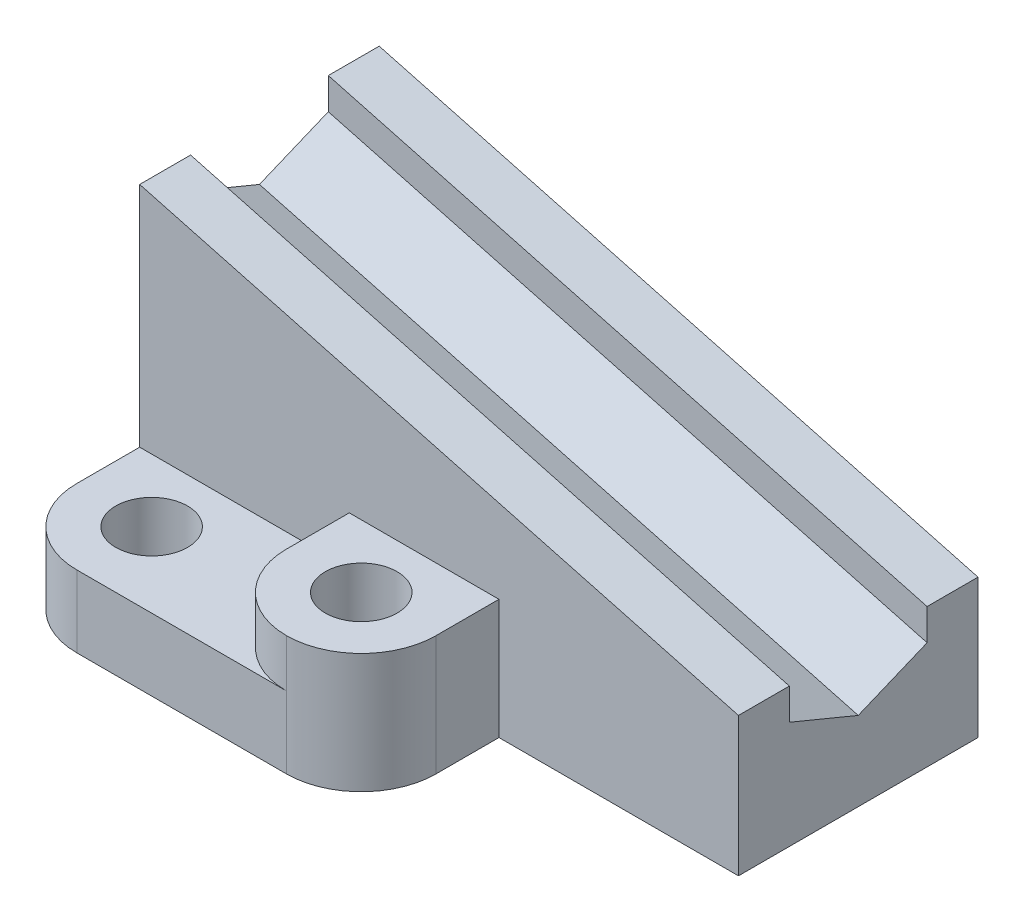
ISO-10303-21;
HEADER;
FILE_DESCRIPTION(('STEP AP214'),'2;1');
FILE_NAME('part.step','',(''),(''),'','','');
FILE_SCHEMA(('AUTOMOTIVE_DESIGN { 1 0 10303 214 1 1 1 1 }'));
ENDSEC;
DATA;
#1=APPLICATION_CONTEXT('core data for automotive mechanical design processes');
#2=APPLICATION_PROTOCOL_DEFINITION('international standard','automotive_design',2000,#1);
#3=PRODUCT_CONTEXT('',#1,'mechanical');
#4=PRODUCT('Part','Part','',(#3));
#5=PRODUCT_RELATED_PRODUCT_CATEGORY('part','',(#4));
#6=PRODUCT_DEFINITION_FORMATION('','',#4);
#7=PRODUCT_DEFINITION_CONTEXT('part definition',#1,'design');
#8=PRODUCT_DEFINITION('design','',#6,#7);
#9=PRODUCT_DEFINITION_SHAPE('','',#8);
#10=(LENGTH_UNIT() NAMED_UNIT(*) SI_UNIT(.MILLI.,.METRE.));
#11=(NAMED_UNIT(*) PLANE_ANGLE_UNIT() SI_UNIT($,.RADIAN.));
#12=(NAMED_UNIT(*) SI_UNIT($,.STERADIAN.) SOLID_ANGLE_UNIT());
#13=UNCERTAINTY_MEASURE_WITH_UNIT(LENGTH_MEASURE(1.E-05),#10,'distance_accuracy_value','');
#14=(GEOMETRIC_REPRESENTATION_CONTEXT(3) GLOBAL_UNCERTAINTY_ASSIGNED_CONTEXT((#13)) GLOBAL_UNIT_ASSIGNED_CONTEXT((#10,
#11,#12)) REPRESENTATION_CONTEXT('',''));
#15=CARTESIAN_POINT('',(0.,0.,0.));
#16=DIRECTION('',(0.,0.,1.));
#17=DIRECTION('',(1.,0.,0.));
#18=AXIS2_PLACEMENT_3D('',#15,#16,#17);
#19=CARTESIAN_POINT('',(0.,50.,-40.));
#20=DIRECTION('',(-0.258819045102514,-0.96592582628907,0.));
#21=DIRECTION('',(0.96592582628907,-0.258819045102514,0.));
#22=AXIS2_PLACEMENT_3D('',#19,#20,#21);
#23=PLANE('',#22);
#24=DIRECTION('',(0.,0.,1.));
#25=VECTOR('',#24,1.);
#26=CARTESIAN_POINT('',(100.,23.2050807568884,-40.));
#27=LINE('',#26,#25);
#28=CARTESIAN_POINT('',(100.,23.2050807568884,-8.49999999999999));
#29=VERTEX_POINT('',#28);
#30=CARTESIAN_POINT('',(100.,23.2050807568884,0.));
#31=VERTEX_POINT('',#30);
#32=EDGE_CURVE('E267',#29,#31,#27,.T.);
#33=ORIENTED_EDGE('',*,*,#32,.F.);
#34=DIRECTION('',(-0.96592582628907,0.258819045102514,0.));
#35=VECTOR('',#34,1.);
#36=CARTESIAN_POINT('',(0.,50.,-8.49999999999999));
#37=LINE('',#36,#35);
#38=CARTESIAN_POINT('',(0.,50.,-8.49999999999999));
#39=VERTEX_POINT('',#38);
#40=EDGE_CURVE('E11',#29,#39,#37,.T.);
#41=ORIENTED_EDGE('',*,*,#40,.T.);
#42=DIRECTION('',(0.,0.,-1.));
#43=VECTOR('',#42,1.);
#44=CARTESIAN_POINT('',(0.,50.,0.));
#45=LINE('',#44,#43);
#46=CARTESIAN_POINT('',(0.,50.,0.));
#47=VERTEX_POINT('',#46);
#48=EDGE_CURVE('E183',#47,#39,#45,.T.);
#49=ORIENTED_EDGE('',*,*,#48,.F.);
#50=DIRECTION('',(0.96592582628907,-0.258819045102514,0.));
#51=VECTOR('',#50,1.);
#52=CARTESIAN_POINT('',(0.,50.,0.));
#53=LINE('',#52,#51);
#54=EDGE_CURVE('E274',#47,#31,#53,.T.);
#55=ORIENTED_EDGE('',*,*,#54,.T.);
#56=EDGE_LOOP('',(#33,#41,#49,#55));
#57=FACE_BOUND('',#56,.T.);
#58=ADVANCED_FACE('F39',(#57),#23,.F.);
#59=CARTESIAN_POINT('',(0.,50.,0.));
#60=DIRECTION('',(0.,0.,-1.));
#61=DIRECTION('',(-1.,0.,0.));
#62=AXIS2_PLACEMENT_3D('',#59,#60,#61);
#63=PLANE('',#62);
#64=DIRECTION('',(0.,-1.,0.));
#65=VECTOR('',#64,1.);
#66=CARTESIAN_POINT('',(100.,50.,0.));
#67=LINE('',#66,#65);
#68=CARTESIAN_POINT('',(100.,0.,0.));
#69=VERTEX_POINT('',#68);
#70=EDGE_CURVE('E217',#31,#69,#67,.T.);
#71=ORIENTED_EDGE('',*,*,#70,.F.);
#72=ORIENTED_EDGE('',*,*,#54,.F.);
#73=DIRECTION('',(0.,-1.,0.));
#74=VECTOR('',#73,1.);
#75=CARTESIAN_POINT('',(0.,50.,0.));
#76=LINE('',#75,#74);
#77=CARTESIAN_POINT('',(0.,12.,0.));
#78=VERTEX_POINT('',#77);
#79=EDGE_CURVE('E189',#47,#78,#76,.T.);
#80=ORIENTED_EDGE('',*,*,#79,.T.);
#81=DIRECTION('',(1.,0.,0.));
#82=VECTOR('',#81,1.);
#83=CARTESIAN_POINT('',(0.,12.,0.));
#84=LINE('',#83,#82);
#85=CARTESIAN_POINT('',(35.,12.,0.));
#86=VERTEX_POINT('',#85);
#87=EDGE_CURVE('E296',#78,#86,#84,.T.);
#88=ORIENTED_EDGE('',*,*,#87,.T.);
#89=DIRECTION('',(0.,-1.,0.));
#90=VECTOR('',#89,1.);
#91=CARTESIAN_POINT('',(35.,20.,0.));
#92=LINE('',#91,#90);
#93=CARTESIAN_POINT('',(35.,20.,0.));
#94=VERTEX_POINT('',#93);
#95=EDGE_CURVE('E284',#94,#86,#92,.T.);
#96=ORIENTED_EDGE('',*,*,#95,.F.);
#97=DIRECTION('',(1.,0.,0.));
#98=VECTOR('',#97,1.);
#99=CARTESIAN_POINT('',(0.,20.,0.));
#100=LINE('',#99,#98);
#101=CARTESIAN_POINT('',(60.,20.,0.));
#102=VERTEX_POINT('',#101);
#103=EDGE_CURVE('E278',#94,#102,#100,.T.);
#104=ORIENTED_EDGE('',*,*,#103,.T.);
#105=DIRECTION('',(0.,-1.,0.));
#106=VECTOR('',#105,1.);
#107=CARTESIAN_POINT('',(60.,20.,0.));
#108=LINE('',#107,#106);
#109=CARTESIAN_POINT('',(60.,0.,0.));
#110=VERTEX_POINT('',#109);
#111=EDGE_CURVE('E289',#102,#110,#108,.T.);
#112=ORIENTED_EDGE('',*,*,#111,.T.);
#113=DIRECTION('',(1.,0.,0.));
#114=VECTOR('',#113,1.);
#115=CARTESIAN_POINT('',(0.,0.,0.));
#116=LINE('',#115,#114);
#117=EDGE_CURVE('E196',#110,#69,#116,.T.);
#118=ORIENTED_EDGE('',*,*,#117,.T.);
#119=EDGE_LOOP('',(#71,#72,#80,#88,#96,#104,#112,#118));
#120=FACE_BOUND('',#119,.T.);
#121=ADVANCED_FACE('F323',(#120),#63,.F.);
#122=CARTESIAN_POINT('',(100.,50.,0.));
#123=DIRECTION('',(-1.,0.,0.));
#124=DIRECTION('',(0.,0.,1.));
#125=AXIS2_PLACEMENT_3D('',#122,#123,#124);
#126=PLANE('',#125);
#127=DIRECTION('',(0.,0.382683432365086,0.923879532511288));
#128=VECTOR('',#127,1.);
#129=CARTESIAN_POINT('',(100.,25.6646397353018,10.0800362668732));
#130=LINE('',#129,#128);
#131=CARTESIAN_POINT('',(100.,13.2050807568884,-20.));
#132=VERTEX_POINT('',#131);
#133=CARTESIAN_POINT('',(100.,17.968536724179,-8.49999999999999));
#134=VERTEX_POINT('',#133);
#135=EDGE_CURVE('E350',#132,#134,#130,.T.);
#136=ORIENTED_EDGE('',*,*,#135,.T.);
#137=DIRECTION('',(0.,1.,0.));
#138=VECTOR('',#137,1.);
#139=CARTESIAN_POINT('',(100.,50.,-8.50000000000001));
#140=LINE('',#139,#138);
#141=EDGE_CURVE('E354',#134,#29,#140,.T.);
#142=ORIENTED_EDGE('',*,*,#141,.T.);
#143=ORIENTED_EDGE('',*,*,#32,.T.);
#144=ORIENTED_EDGE('',*,*,#70,.T.);
#145=DIRECTION('',(0.,0.,-1.));
#146=VECTOR('',#145,1.);
#147=CARTESIAN_POINT('',(100.,0.,0.));
#148=LINE('',#147,#146);
#149=CARTESIAN_POINT('',(100.,0.,-40.));
#150=VERTEX_POINT('',#149);
#151=EDGE_CURVE('E200',#69,#150,#148,.T.);
#152=ORIENTED_EDGE('',*,*,#151,.T.);
#153=DIRECTION('',(0.,-1.,0.));
#154=VECTOR('',#153,1.);
#155=CARTESIAN_POINT('',(100.,50.,-40.));
#156=LINE('',#155,#154);
#157=CARTESIAN_POINT('',(100.,23.2050807568884,-40.));
#158=VERTEX_POINT('',#157);
#159=EDGE_CURVE('E214',#158,#150,#156,.T.);
#160=ORIENTED_EDGE('',*,*,#159,.F.);
#161=CARTESIAN_POINT('',(100.,23.2050807568884,-31.5));
#162=VERTEX_POINT('',#161);
#163=EDGE_CURVE('E258',#158,#162,#27,.T.);
#164=ORIENTED_EDGE('',*,*,#163,.T.);
#165=DIRECTION('',(0.,-1.,0.));
#166=VECTOR('',#165,1.);
#167=CARTESIAN_POINT('',(100.,50.,-31.5));
#168=LINE('',#167,#166);
#169=CARTESIAN_POINT('',(100.,17.968536724179,-31.5));
#170=VERTEX_POINT('',#169);
#171=EDGE_CURVE('E55',#162,#170,#168,.T.);
#172=ORIENTED_EDGE('',*,*,#171,.T.);
#173=DIRECTION('',(0.,-0.382683432365086,0.923879532511288));
#174=VECTOR('',#173,1.);
#175=CARTESIAN_POINT('',(100.,11.5225041115709,-15.9379006431422));
#176=LINE('',#175,#174);
#177=EDGE_CURVE('E358',#170,#132,#176,.T.);
#178=ORIENTED_EDGE('',*,*,#177,.T.);
#179=EDGE_LOOP('',(#136,#142,#143,#144,#152,#160,#164,#172,#178));
#180=FACE_BOUND('',#179,.T.);
#181=ADVANCED_FACE('F344',(#180),#126,.F.);
#182=CARTESIAN_POINT('',(0.,50.,-40.));
#183=DIRECTION('',(0.,0.,-1.));
#184=DIRECTION('',(-1.,0.,0.));
#185=AXIS2_PLACEMENT_3D('',#182,#183,#184);
#186=PLANE('',#185);
#187=DIRECTION('',(0.96592582628907,-0.258819045102514,0.));
#188=VECTOR('',#187,1.);
#189=CARTESIAN_POINT('',(0.,50.,-40.));
#190=LINE('',#189,#188);
#191=CARTESIAN_POINT('',(0.,50.,-40.));
#192=VERTEX_POINT('',#191);
#193=EDGE_CURVE('E180',#192,#158,#190,.T.);
#194=ORIENTED_EDGE('',*,*,#193,.T.);
#195=ORIENTED_EDGE('',*,*,#159,.T.);
#196=DIRECTION('',(1.,0.,0.));
#197=VECTOR('',#196,1.);
#198=CARTESIAN_POINT('',(0.,0.,-40.));
#199=LINE('',#198,#197);
#200=CARTESIAN_POINT('',(0.,0.,-40.));
#201=VERTEX_POINT('',#200);
#202=EDGE_CURVE('E190',#201,#150,#199,.T.);
#203=ORIENTED_EDGE('',*,*,#202,.F.);
#204=DIRECTION('',(0.,-1.,0.));
#205=VECTOR('',#204,1.);
#206=CARTESIAN_POINT('',(0.,50.,-40.));
#207=LINE('',#206,#205);
#208=EDGE_CURVE('E211',#192,#201,#207,.T.);
#209=ORIENTED_EDGE('',*,*,#208,.F.);
#210=EDGE_LOOP('',(#194,#195,#203,#209));
#211=FACE_BOUND('',#210,.T.);
#212=ADVANCED_FACE('F370',(#211),#186,.T.);
#213=CARTESIAN_POINT('',(0.,50.,0.));
#214=DIRECTION('',(-1.,0.,0.));
#215=DIRECTION('',(0.,0.,1.));
#216=AXIS2_PLACEMENT_3D('',#213,#214,#215);
#217=PLANE('',#216);
#218=DIRECTION('',(0.,1.,0.));
#219=VECTOR('',#218,1.);
#220=CARTESIAN_POINT('',(0.,50.,-8.49999999999999));
#221=LINE('',#220,#219);
#222=CARTESIAN_POINT('',(0.,44.7634559672905,-8.49999999999999));
#223=VERTEX_POINT('',#222);
#224=EDGE_CURVE('E351',#223,#39,#221,.T.);
#225=ORIENTED_EDGE('',*,*,#224,.F.);
#226=DIRECTION('',(0.,0.382683432365086,0.923879532511288));
#227=VECTOR('',#226,1.);
#228=CARTESIAN_POINT('',(0.,44.7634559672905,-8.49999999999999));
#229=LINE('',#228,#227);
#230=CARTESIAN_POINT('',(0.,40.,-20.));
#231=VERTEX_POINT('',#230);
#232=EDGE_CURVE('E439',#231,#223,#229,.T.);
#233=ORIENTED_EDGE('',*,*,#232,.F.);
#234=DIRECTION('',(0.,-0.382683432365086,0.923879532511288));
#235=VECTOR('',#234,1.);
#236=CARTESIAN_POINT('',(0.,44.7634559672905,-31.5));
#237=LINE('',#236,#235);
#238=CARTESIAN_POINT('',(0.,44.7634559672905,-31.5));
#239=VERTEX_POINT('',#238);
#240=EDGE_CURVE('E174',#239,#231,#237,.T.);
#241=ORIENTED_EDGE('',*,*,#240,.F.);
#242=DIRECTION('',(0.,-1.,0.));
#243=VECTOR('',#242,1.);
#244=CARTESIAN_POINT('',(0.,50.,-31.5));
#245=LINE('',#244,#243);
#246=CARTESIAN_POINT('',(0.,50.,-31.5));
#247=VERTEX_POINT('',#246);
#248=EDGE_CURVE('E159',#247,#239,#245,.T.);
#249=ORIENTED_EDGE('',*,*,#248,.F.);
#250=EDGE_CURVE('E170',#247,#192,#45,.T.);
#251=ORIENTED_EDGE('',*,*,#250,.T.);
#252=ORIENTED_EDGE('',*,*,#208,.T.);
#253=DIRECTION('',(0.,0.,-1.));
#254=VECTOR('',#253,1.);
#255=CARTESIAN_POINT('',(0.,0.,0.));
#256=LINE('',#255,#254);
#257=CARTESIAN_POINT('',(0.,0.,10.5));
#258=VERTEX_POINT('',#257);
#259=EDGE_CURVE('E184',#258,#201,#256,.T.);
#260=ORIENTED_EDGE('',*,*,#259,.F.);
#261=DIRECTION('',(0.,-1.,0.));
#262=VECTOR('',#261,1.);
#263=CARTESIAN_POINT('',(0.,12.,10.5));
#264=LINE('',#263,#262);
#265=CARTESIAN_POINT('',(0.,12.,10.5));
#266=VERTEX_POINT('',#265);
#267=EDGE_CURVE('E234',#258,#266,#264,.F.);
#268=ORIENTED_EDGE('',*,*,#267,.T.);
#269=DIRECTION('',(0.,0.,1.));
#270=VECTOR('',#269,1.);
#271=CARTESIAN_POINT('',(0.,12.,0.));
#272=LINE('',#271,#270);
#273=EDGE_CURVE('E300',#78,#266,#272,.T.);
#274=ORIENTED_EDGE('',*,*,#273,.F.);
#275=ORIENTED_EDGE('',*,*,#79,.F.);
#276=ORIENTED_EDGE('',*,*,#48,.T.);
#277=EDGE_LOOP('',(#225,#233,#241,#249,#251,#252,#260,#268,#274,#275,#276));
#278=FACE_BOUND('',#277,.T.);
#279=ADVANCED_FACE('F168',(#278),#217,.T.);
#280=CARTESIAN_POINT('',(0.,0.,0.));
#281=DIRECTION('',(0.,1.,0.));
#282=DIRECTION('',(0.,0.,1.));
#283=AXIS2_PLACEMENT_3D('',#280,#281,#282);
#284=PLANE('',#283);
#285=CARTESIAN_POINT('',(12.5,0.,10.5));
#286=DIRECTION('',(0.,1.,0.));
#287=DIRECTION('',(0.,0.,1.));
#288=AXIS2_PLACEMENT_3D('',#285,#286,#287);
#289=CIRCLE('',#288,6.);
#290=CARTESIAN_POINT('',(12.5,0.,16.5));
#291=VERTEX_POINT('',#290);
#292=EDGE_CURVE('E425',#291,#291,#289,.T.);
#293=ORIENTED_EDGE('',*,*,#292,.T.);
#294=EDGE_LOOP('',(#293));
#295=FACE_BOUND('',#294,.T.);
#296=CARTESIAN_POINT('',(47.5,0.,10.5));
#297=DIRECTION('',(0.,1.,0.));
#298=DIRECTION('',(0.,0.,1.));
#299=AXIS2_PLACEMENT_3D('',#296,#297,#298);
#300=CIRCLE('',#299,6.);
#301=CARTESIAN_POINT('',(47.5,0.,16.5));
#302=VERTEX_POINT('',#301);
#303=EDGE_CURVE('E176',#302,#302,#300,.T.);
#304=ORIENTED_EDGE('',*,*,#303,.T.);
#305=EDGE_LOOP('',(#304));
#306=FACE_BOUND('',#305,.T.);
#307=DIRECTION('',(1.,0.,0.));
#308=VECTOR('',#307,1.);
#309=CARTESIAN_POINT('',(0.,0.,23.));
#310=LINE('',#309,#308);
#311=CARTESIAN_POINT('',(12.5,0.,23.));
#312=VERTEX_POINT('',#311);
#313=CARTESIAN_POINT('',(47.5,0.,23.));
#314=VERTEX_POINT('',#313);
#315=EDGE_CURVE('E194',#312,#314,#310,.T.);
#316=ORIENTED_EDGE('',*,*,#315,.F.);
#317=CARTESIAN_POINT('',(12.5,0.,10.5));
#318=DIRECTION('',(0.,1.,0.));
#319=DIRECTION('',(0.,0.,1.));
#320=AXIS2_PLACEMENT_3D('',#317,#318,#319);
#321=CIRCLE('',#320,12.5);
#322=EDGE_CURVE('E231',#312,#258,#321,.F.);
#323=ORIENTED_EDGE('',*,*,#322,.T.);
#324=ORIENTED_EDGE('',*,*,#259,.T.);
#325=ORIENTED_EDGE('',*,*,#202,.T.);
#326=ORIENTED_EDGE('',*,*,#151,.F.);
#327=ORIENTED_EDGE('',*,*,#117,.F.);
#328=DIRECTION('',(0.,0.,-1.));
#329=VECTOR('',#328,1.);
#330=CARTESIAN_POINT('',(60.,0.,0.));
#331=LINE('',#330,#329);
#332=CARTESIAN_POINT('',(60.,0.,10.5));
#333=VERTEX_POINT('',#332);
#334=EDGE_CURVE('E257',#333,#110,#331,.T.);
#335=ORIENTED_EDGE('',*,*,#334,.F.);
#336=CARTESIAN_POINT('',(47.5,0.,10.5));
#337=DIRECTION('',(0.,1.,0.));
#338=DIRECTION('',(0.,0.,1.));
#339=AXIS2_PLACEMENT_3D('',#336,#337,#338);
#340=CIRCLE('',#339,12.5);
#341=EDGE_CURVE('E228',#333,#314,#340,.F.);
#342=ORIENTED_EDGE('',*,*,#341,.T.);
#343=EDGE_LOOP('',(#316,#323,#324,#325,#326,#327,#335,#342));
#344=FACE_BOUND('',#343,.T.);
#345=ADVANCED_FACE('F332',(#295,#306,#344),#284,.F.);
#346=CARTESIAN_POINT('',(0.,12.,23.));
#347=DIRECTION('',(0.,0.,-1.));
#348=DIRECTION('',(-1.,0.,0.));
#349=AXIS2_PLACEMENT_3D('',#346,#347,#348);
#350=PLANE('',#349);
#351=DIRECTION('',(1.,0.,0.));
#352=VECTOR('',#351,1.);
#353=CARTESIAN_POINT('',(0.,12.,23.));
#354=LINE('',#353,#352);
#355=CARTESIAN_POINT('',(12.5,12.,23.));
#356=VERTEX_POINT('',#355);
#357=CARTESIAN_POINT('',(47.5,12.,23.));
#358=VERTEX_POINT('',#357);
#359=EDGE_CURVE('E201',#356,#358,#354,.T.);
#360=ORIENTED_EDGE('',*,*,#359,.F.);
#361=DIRECTION('',(0.,-1.,0.));
#362=VECTOR('',#361,1.);
#363=CARTESIAN_POINT('',(12.5,0.,23.));
#364=LINE('',#363,#362);
#365=EDGE_CURVE('E224',#356,#312,#364,.T.);
#366=ORIENTED_EDGE('',*,*,#365,.T.);
#367=ORIENTED_EDGE('',*,*,#315,.T.);
#368=DIRECTION('',(0.,-1.,0.));
#369=VECTOR('',#368,1.);
#370=CARTESIAN_POINT('',(47.5,12.,23.));
#371=LINE('',#370,#369);
#372=EDGE_CURVE('E220',#314,#358,#371,.F.);
#373=ORIENTED_EDGE('',*,*,#372,.T.);
#374=EDGE_LOOP('',(#360,#366,#367,#373));
#375=FACE_BOUND('',#374,.T.);
#376=ADVANCED_FACE('F312',(#375),#350,.F.);
#377=CARTESIAN_POINT('',(0.,12.,0.));
#378=DIRECTION('',(0.,1.,0.));
#379=DIRECTION('',(0.,0.,1.));
#380=AXIS2_PLACEMENT_3D('',#377,#378,#379);
#381=PLANE('',#380);
#382=CARTESIAN_POINT('',(12.5,12.,10.5));
#383=DIRECTION('',(0.,1.,0.));
#384=DIRECTION('',(0.,0.,1.));
#385=AXIS2_PLACEMENT_3D('',#382,#383,#384);
#386=CIRCLE('',#385,6.);
#387=CARTESIAN_POINT('',(12.5,12.,16.5));
#388=VERTEX_POINT('',#387);
#389=EDGE_CURVE('E477',#388,#388,#386,.T.);
#390=ORIENTED_EDGE('',*,*,#389,.F.);
#391=EDGE_LOOP('',(#390));
#392=FACE_BOUND('',#391,.T.);
#393=ORIENTED_EDGE('',*,*,#273,.T.);
#394=CARTESIAN_POINT('',(12.5,12.,10.5));
#395=DIRECTION('',(0.,1.,0.));
#396=DIRECTION('',(0.,0.,1.));
#397=AXIS2_PLACEMENT_3D('',#394,#395,#396);
#398=CIRCLE('',#397,12.5);
#399=EDGE_CURVE('E237',#266,#356,#398,.T.);
#400=ORIENTED_EDGE('',*,*,#399,.T.);
#401=ORIENTED_EDGE('',*,*,#359,.T.);
#402=CARTESIAN_POINT('',(47.5,12.,10.5));
#403=DIRECTION('',(0.,1.,0.));
#404=DIRECTION('',(0.,0.,1.));
#405=AXIS2_PLACEMENT_3D('',#402,#403,#404);
#406=CIRCLE('',#405,12.5);
#407=CARTESIAN_POINT('',(35.,12.,10.5));
#408=VERTEX_POINT('',#407);
#409=EDGE_CURVE('E165',#358,#408,#406,.F.);
#410=ORIENTED_EDGE('',*,*,#409,.T.);
#411=DIRECTION('',(0.,0.,1.));
#412=VECTOR('',#411,1.);
#413=CARTESIAN_POINT('',(35.,12.,0.));
#414=LINE('',#413,#412);
#415=EDGE_CURVE('E293',#86,#408,#414,.T.);
#416=ORIENTED_EDGE('',*,*,#415,.F.);
#417=ORIENTED_EDGE('',*,*,#87,.F.);
#418=EDGE_LOOP('',(#393,#400,#401,#410,#416,#417));
#419=FACE_BOUND('',#418,.T.);
#420=ADVANCED_FACE('F306',(#392,#419),#381,.T.);
#421=CARTESIAN_POINT('',(60.,20.,0.));
#422=DIRECTION('',(-1.,0.,0.));
#423=DIRECTION('',(0.,0.,1.));
#424=AXIS2_PLACEMENT_3D('',#421,#422,#423);
#425=PLANE('',#424);
#426=DIRECTION('',(0.,0.,-1.));
#427=VECTOR('',#426,1.);
#428=CARTESIAN_POINT('',(60.,20.,0.));
#429=LINE('',#428,#427);
#430=CARTESIAN_POINT('',(60.,20.,10.5));
#431=VERTEX_POINT('',#430);
#432=EDGE_CURVE('E265',#431,#102,#429,.T.);
#433=ORIENTED_EDGE('',*,*,#432,.F.);
#434=DIRECTION('',(0.,-1.,0.));
#435=VECTOR('',#434,1.);
#436=CARTESIAN_POINT('',(60.,20.,10.5));
#437=LINE('',#436,#435);
#438=EDGE_CURVE('E240',#431,#333,#437,.T.);
#439=ORIENTED_EDGE('',*,*,#438,.T.);
#440=ORIENTED_EDGE('',*,*,#334,.T.);
#441=ORIENTED_EDGE('',*,*,#111,.F.);
#442=EDGE_LOOP('',(#433,#439,#440,#441));
#443=FACE_BOUND('',#442,.T.);
#444=ADVANCED_FACE('F340',(#443),#425,.F.);
#445=CARTESIAN_POINT('',(35.,20.,0.));
#446=DIRECTION('',(1.,0.,0.));
#447=DIRECTION('',(0.,0.,-1.));
#448=AXIS2_PLACEMENT_3D('',#445,#446,#447);
#449=PLANE('',#448);
#450=ORIENTED_EDGE('',*,*,#415,.T.);
#451=DIRECTION('',(0.,-1.,0.));
#452=VECTOR('',#451,1.);
#453=CARTESIAN_POINT('',(35.,20.,10.5));
#454=LINE('',#453,#452);
#455=CARTESIAN_POINT('',(35.,20.,10.5));
#456=VERTEX_POINT('',#455);
#457=EDGE_CURVE('E63',#408,#456,#454,.F.);
#458=ORIENTED_EDGE('',*,*,#457,.T.);
#459=DIRECTION('',(0.,0.,1.));
#460=VECTOR('',#459,1.);
#461=CARTESIAN_POINT('',(35.,20.,0.));
#462=LINE('',#461,#460);
#463=EDGE_CURVE('E282',#94,#456,#462,.T.);
#464=ORIENTED_EDGE('',*,*,#463,.F.);
#465=ORIENTED_EDGE('',*,*,#95,.T.);
#466=EDGE_LOOP('',(#450,#458,#464,#465));
#467=FACE_BOUND('',#466,.T.);
#468=ADVANCED_FACE('F320',(#467),#449,.F.);
#469=CARTESIAN_POINT('',(0.,20.,0.));
#470=DIRECTION('',(0.,1.,0.));
#471=DIRECTION('',(0.,0.,1.));
#472=AXIS2_PLACEMENT_3D('',#469,#470,#471);
#473=PLANE('',#472);
#474=CARTESIAN_POINT('',(47.5,20.,10.5));
#475=DIRECTION('',(0.,1.,0.));
#476=DIRECTION('',(0.,0.,1.));
#477=AXIS2_PLACEMENT_3D('',#474,#475,#476);
#478=CIRCLE('',#477,6.);
#479=CARTESIAN_POINT('',(47.5,20.,16.5));
#480=VERTEX_POINT('',#479);
#481=EDGE_CURVE('E430',#480,#480,#478,.T.);
#482=ORIENTED_EDGE('',*,*,#481,.F.);
#483=EDGE_LOOP('',(#482));
#484=FACE_BOUND('',#483,.T.);
#485=CARTESIAN_POINT('',(47.5,20.,10.5));
#486=DIRECTION('',(0.,1.,0.));
#487=DIRECTION('',(0.,0.,1.));
#488=AXIS2_PLACEMENT_3D('',#485,#486,#487);
#489=CIRCLE('',#488,12.5);
#490=CARTESIAN_POINT('',(47.5,20.,23.));
#491=VERTEX_POINT('',#490);
#492=EDGE_CURVE('E244',#456,#491,#489,.T.);
#493=ORIENTED_EDGE('',*,*,#492,.T.);
#494=CARTESIAN_POINT('',(47.5,20.,10.5));
#495=DIRECTION('',(0.,1.,0.));
#496=DIRECTION('',(0.,0.,1.));
#497=AXIS2_PLACEMENT_3D('',#494,#495,#496);
#498=CIRCLE('',#497,12.5);
#499=EDGE_CURVE('E247',#491,#431,#498,.T.);
#500=ORIENTED_EDGE('',*,*,#499,.T.);
#501=ORIENTED_EDGE('',*,*,#432,.T.);
#502=ORIENTED_EDGE('',*,*,#103,.F.);
#503=ORIENTED_EDGE('',*,*,#463,.T.);
#504=EDGE_LOOP('',(#493,#500,#501,#502,#503));
#505=FACE_BOUND('',#504,.T.);
#506=ADVANCED_FACE('F317',(#484,#505),#473,.T.);
#507=CARTESIAN_POINT('',(12.5,12.,10.5));
#508=DIRECTION('',(0.,1.,0.));
#509=DIRECTION('',(0.,0.,1.));
#510=AXIS2_PLACEMENT_3D('',#507,#508,#509);
#511=CYLINDRICAL_SURFACE('',#510,12.5);
#512=ORIENTED_EDGE('',*,*,#399,.F.);
#513=ORIENTED_EDGE('',*,*,#267,.F.);
#514=ORIENTED_EDGE('',*,*,#322,.F.);
#515=ORIENTED_EDGE('',*,*,#365,.F.);
#516=EDGE_LOOP('',(#512,#513,#514,#515));
#517=FACE_BOUND('',#516,.T.);
#518=ADVANCED_FACE('F330',(#517),#511,.T.);
#519=CARTESIAN_POINT('',(47.5,12.,10.5));
#520=DIRECTION('',(0.,-1.,0.));
#521=DIRECTION('',(0.,0.,-1.));
#522=AXIS2_PLACEMENT_3D('',#519,#520,#521);
#523=CYLINDRICAL_SURFACE('',#522,12.5);
#524=ORIENTED_EDGE('',*,*,#457,.F.);
#525=ORIENTED_EDGE('',*,*,#409,.F.);
#526=DIRECTION('',(0.,-1.,0.));
#527=VECTOR('',#526,1.);
#528=CARTESIAN_POINT('',(47.5,12.,23.));
#529=LINE('',#528,#527);
#530=EDGE_CURVE('E254',#491,#358,#529,.T.);
#531=ORIENTED_EDGE('',*,*,#530,.F.);
#532=ORIENTED_EDGE('',*,*,#492,.F.);
#533=EDGE_LOOP('',(#524,#525,#531,#532));
#534=FACE_BOUND('',#533,.T.);
#535=ADVANCED_FACE('F41',(#534),#523,.T.);
#536=CARTESIAN_POINT('',(47.5,20.,10.5));
#537=DIRECTION('',(0.,-1.,0.));
#538=DIRECTION('',(0.,0.,-1.));
#539=AXIS2_PLACEMENT_3D('',#536,#537,#538);
#540=CYLINDRICAL_SURFACE('',#539,12.5);
#541=ORIENTED_EDGE('',*,*,#530,.T.);
#542=ORIENTED_EDGE('',*,*,#372,.F.);
#543=ORIENTED_EDGE('',*,*,#341,.F.);
#544=ORIENTED_EDGE('',*,*,#438,.F.);
#545=ORIENTED_EDGE('',*,*,#499,.F.);
#546=EDGE_LOOP('',(#541,#542,#543,#544,#545));
#547=FACE_BOUND('',#546,.T.);
#548=ADVANCED_FACE('F338',(#547),#540,.T.);
#549=ORIENTED_EDGE('',*,*,#250,.F.);
#550=DIRECTION('',(0.96592582628907,-0.258819045102514,0.));
#551=VECTOR('',#550,1.);
#552=CARTESIAN_POINT('',(0.,50.,-31.5));
#553=LINE('',#552,#551);
#554=EDGE_CURVE('E48',#247,#162,#553,.T.);
#555=ORIENTED_EDGE('',*,*,#554,.T.);
#556=ORIENTED_EDGE('',*,*,#163,.F.);
#557=ORIENTED_EDGE('',*,*,#193,.F.);
#558=EDGE_LOOP('',(#549,#555,#556,#557));
#559=FACE_BOUND('',#558,.T.);
#560=ADVANCED_FACE('F178',(#559),#23,.F.);
#561=CARTESIAN_POINT('',(105.801270189222,16.4140910619023,-8.49999999999999));
#562=DIRECTION('',(-0.240299198479751,-0.896808817744532,0.371470375165563));
#563=DIRECTION('',(0.,-0.382683432365086,-0.923879532511288));
#564=AXIS2_PLACEMENT_3D('',#561,#562,#563);
#565=PLANE('',#564);
#566=DIRECTION('',(-0.96592582628907,0.258819045102514,0.));
#567=VECTOR('',#566,1.);
#568=CARTESIAN_POINT('',(105.801270189222,11.6506350946117,-20.));
#569=LINE('',#568,#567);
#570=EDGE_CURVE('E448',#132,#231,#569,.T.);
#571=ORIENTED_EDGE('',*,*,#570,.T.);
#572=ORIENTED_EDGE('',*,*,#232,.T.);
#573=DIRECTION('',(-0.96592582628907,0.258819045102514,0.));
#574=VECTOR('',#573,1.);
#575=CARTESIAN_POINT('',(105.801270189222,16.4140910619023,-8.49999999999999));
#576=LINE('',#575,#574);
#577=EDGE_CURVE('E363',#134,#223,#576,.T.);
#578=ORIENTED_EDGE('',*,*,#577,.F.);
#579=ORIENTED_EDGE('',*,*,#135,.F.);
#580=EDGE_LOOP('',(#571,#572,#578,#579));
#581=FACE_BOUND('',#580,.T.);
#582=ADVANCED_FACE('F388',(#581),#565,.F.);
#583=CARTESIAN_POINT('',(105.801270189222,16.4140910619023,-31.5));
#584=DIRECTION('',(-0.240299198479751,-0.896808817744532,-0.371470375165563));
#585=DIRECTION('',(0.,0.382683432365086,-0.923879532511288));
#586=AXIS2_PLACEMENT_3D('',#583,#584,#585);
#587=PLANE('',#586);
#588=DIRECTION('',(-0.96592582628907,0.258819045102514,0.));
#589=VECTOR('',#588,1.);
#590=CARTESIAN_POINT('',(105.801270189222,16.4140910619023,-31.5));
#591=LINE('',#590,#589);
#592=EDGE_CURVE('E445',#170,#239,#591,.T.);
#593=ORIENTED_EDGE('',*,*,#592,.T.);
#594=ORIENTED_EDGE('',*,*,#240,.T.);
#595=ORIENTED_EDGE('',*,*,#570,.F.);
#596=ORIENTED_EDGE('',*,*,#177,.F.);
#597=EDGE_LOOP('',(#593,#594,#595,#596));
#598=FACE_BOUND('',#597,.T.);
#599=ADVANCED_FACE('F393',(#598),#587,.F.);
#600=CARTESIAN_POINT('',(105.801270189222,21.6506350946117,-8.49999999999999));
#601=DIRECTION('',(0.,0.,1.));
#602=DIRECTION('',(0.,-1.,0.));
#603=AXIS2_PLACEMENT_3D('',#600,#601,#602);
#604=PLANE('',#603);
#605=ORIENTED_EDGE('',*,*,#577,.T.);
#606=ORIENTED_EDGE('',*,*,#224,.T.);
#607=ORIENTED_EDGE('',*,*,#40,.F.);
#608=ORIENTED_EDGE('',*,*,#141,.F.);
#609=EDGE_LOOP('',(#605,#606,#607,#608));
#610=FACE_BOUND('',#609,.T.);
#611=ADVANCED_FACE('F353',(#610),#604,.F.);
#612=CARTESIAN_POINT('',(105.801270189222,21.6506350946117,-31.5));
#613=DIRECTION('',(0.,0.,-1.));
#614=DIRECTION('',(-1.,0.,0.));
#615=AXIS2_PLACEMENT_3D('',#612,#613,#614);
#616=PLANE('',#615);
#617=ORIENTED_EDGE('',*,*,#554,.F.);
#618=ORIENTED_EDGE('',*,*,#248,.T.);
#619=ORIENTED_EDGE('',*,*,#592,.F.);
#620=ORIENTED_EDGE('',*,*,#171,.F.);
#621=EDGE_LOOP('',(#617,#618,#619,#620));
#622=FACE_BOUND('',#621,.T.);
#623=ADVANCED_FACE('F158',(#622),#616,.F.);
#624=CARTESIAN_POINT('',(47.5,20.,10.5));
#625=DIRECTION('',(0.,1.,0.));
#626=DIRECTION('',(0.,0.,1.));
#627=AXIS2_PLACEMENT_3D('',#624,#625,#626);
#628=CYLINDRICAL_SURFACE('',#627,6.);
#629=ORIENTED_EDGE('',*,*,#303,.F.);
#630=EDGE_LOOP('',(#629));
#631=FACE_BOUND('',#630,.T.);
#632=ORIENTED_EDGE('',*,*,#481,.T.);
#633=EDGE_LOOP('',(#632));
#634=FACE_BOUND('',#633,.T.);
#635=ADVANCED_FACE('F460',(#631,#634),#628,.F.);
#636=CARTESIAN_POINT('',(12.5,12.,10.5));
#637=DIRECTION('',(0.,1.,0.));
#638=DIRECTION('',(0.,0.,1.));
#639=AXIS2_PLACEMENT_3D('',#636,#637,#638);
#640=CYLINDRICAL_SURFACE('',#639,6.);
#641=ORIENTED_EDGE('',*,*,#292,.F.);
#642=EDGE_LOOP('',(#641));
#643=FACE_BOUND('',#642,.T.);
#644=ORIENTED_EDGE('',*,*,#389,.T.);
#645=EDGE_LOOP('',(#644));
#646=FACE_BOUND('',#645,.T.);
#647=ADVANCED_FACE('F464',(#643,#646),#640,.F.);
#648=CLOSED_SHELL('',(#58,#121,#181,#212,#279,#345,#376,#420,#444,#468,#506,#518,#535,#548,#560,
#582,#599,#611,#623,#635,#647));
#649=MANIFOLD_SOLID_BREP('B2',#648);
#650=ADVANCED_BREP_SHAPE_REPRESENTATION('',(#18,#649),#14);
#651=SHAPE_DEFINITION_REPRESENTATION(#9,#650);
ENDSEC;
END-ISO-10303-21;
